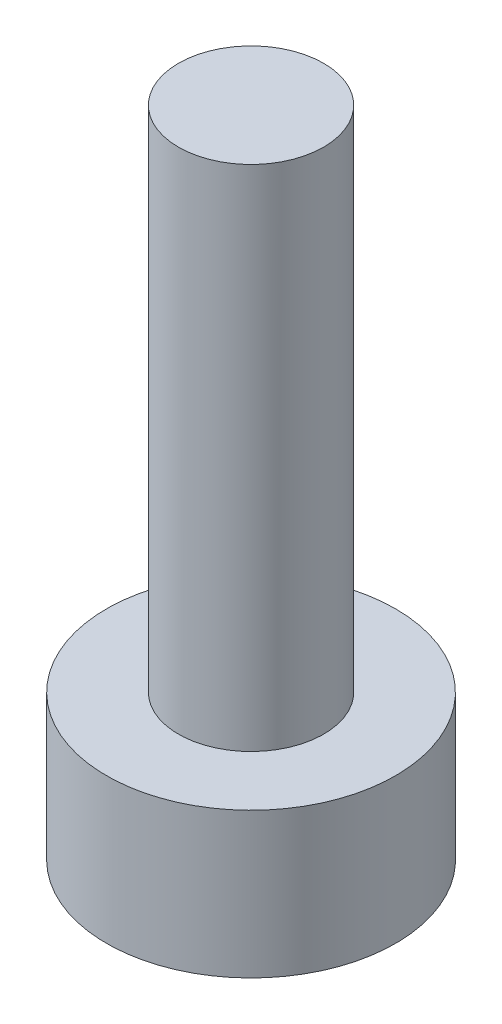
ISO-10303-21;
HEADER;
FILE_DESCRIPTION(('STEP AP214'),'2;1');
FILE_NAME('part.step','',(''),(''),'','','');
FILE_SCHEMA(('AUTOMOTIVE_DESIGN { 1 0 10303 214 1 1 1 1 }'));
ENDSEC;
DATA;
#1=APPLICATION_CONTEXT('core data for automotive mechanical design processes');
#2=APPLICATION_PROTOCOL_DEFINITION('international standard','automotive_design',2000,#1);
#3=PRODUCT_CONTEXT('',#1,'mechanical');
#4=PRODUCT('Part','Part','',(#3));
#5=PRODUCT_RELATED_PRODUCT_CATEGORY('part','',(#4));
#6=PRODUCT_DEFINITION_FORMATION('','',#4);
#7=PRODUCT_DEFINITION_CONTEXT('part definition',#1,'design');
#8=PRODUCT_DEFINITION('design','',#6,#7);
#9=PRODUCT_DEFINITION_SHAPE('','',#8);
#10=(LENGTH_UNIT() NAMED_UNIT(*) SI_UNIT(.MILLI.,.METRE.));
#11=(NAMED_UNIT(*) PLANE_ANGLE_UNIT() SI_UNIT($,.RADIAN.));
#12=(NAMED_UNIT(*) SI_UNIT($,.STERADIAN.) SOLID_ANGLE_UNIT());
#13=UNCERTAINTY_MEASURE_WITH_UNIT(LENGTH_MEASURE(1.E-05),#10,'distance_accuracy_value','');
#14=(GEOMETRIC_REPRESENTATION_CONTEXT(3) GLOBAL_UNCERTAINTY_ASSIGNED_CONTEXT((#13)) GLOBAL_UNIT_ASSIGNED_CONTEXT((#10,
#11,#12)) REPRESENTATION_CONTEXT('',''));
#15=CARTESIAN_POINT('',(0.,0.,0.));
#16=DIRECTION('',(0.,0.,1.));
#17=DIRECTION('',(1.,0.,0.));
#18=AXIS2_PLACEMENT_3D('',#15,#16,#17);
#19=CARTESIAN_POINT('',(0.,7.,0.));
#20=DIRECTION('',(0.,-1.,0.));
#21=DIRECTION('',(0.,0.,-1.));
#22=AXIS2_PLACEMENT_3D('',#19,#20,#21);
#23=CYLINDRICAL_SURFACE('',#22,1.);
#24=CARTESIAN_POINT('',(0.,7.,0.));
#25=DIRECTION('',(0.,1.,0.));
#26=DIRECTION('',(0.,0.,1.));
#27=AXIS2_PLACEMENT_3D('',#24,#25,#26);
#28=CIRCLE('',#27,1.);
#29=CARTESIAN_POINT('',(0.,7.,1.));
#30=VERTEX_POINT('',#29);
#31=EDGE_CURVE('E10',#30,#30,#28,.T.);
#32=ORIENTED_EDGE('',*,*,#31,.F.);
#33=EDGE_LOOP('',(#32));
#34=FACE_BOUND('',#33,.T.);
#35=CARTESIAN_POINT('',(0.,0.,0.));
#36=DIRECTION('',(0.,-1.,0.));
#37=DIRECTION('',(0.,0.,-1.));
#38=AXIS2_PLACEMENT_3D('',#35,#36,#37);
#39=CIRCLE('',#38,1.);
#40=CARTESIAN_POINT('',(0.,0.,-1.));
#41=VERTEX_POINT('',#40);
#42=EDGE_CURVE('E39',#41,#41,#39,.T.);
#43=ORIENTED_EDGE('',*,*,#42,.F.);
#44=EDGE_LOOP('',(#43));
#45=FACE_BOUND('',#44,.T.);
#46=ADVANCED_FACE('F33',(#34,#45),#23,.T.);
#47=CARTESIAN_POINT('',(0.,7.,0.));
#48=DIRECTION('',(0.,1.,0.));
#49=DIRECTION('',(0.,0.,1.));
#50=AXIS2_PLACEMENT_3D('',#47,#48,#49);
#51=PLANE('',#50);
#52=ORIENTED_EDGE('',*,*,#31,.T.);
#53=EDGE_LOOP('',(#52));
#54=FACE_BOUND('',#53,.T.);
#55=ADVANCED_FACE('F66',(#54),#51,.T.);
#56=CARTESIAN_POINT('',(0.,-2.,0.));
#57=DIRECTION('',(0.,1.,0.));
#58=DIRECTION('',(0.,0.,1.));
#59=AXIS2_PLACEMENT_3D('',#56,#57,#58);
#60=CYLINDRICAL_SURFACE('',#59,1.99);
#61=CARTESIAN_POINT('',(0.,-2.,0.));
#62=DIRECTION('',(0.,-1.,0.));
#63=DIRECTION('',(0.,0.,-1.));
#64=AXIS2_PLACEMENT_3D('',#61,#62,#63);
#65=CIRCLE('',#64,1.99);
#66=CARTESIAN_POINT('',(0.,-2.,-1.99));
#67=VERTEX_POINT('',#66);
#68=EDGE_CURVE('E43',#67,#67,#65,.T.);
#69=ORIENTED_EDGE('',*,*,#68,.F.);
#70=EDGE_LOOP('',(#69));
#71=FACE_BOUND('',#70,.T.);
#72=CARTESIAN_POINT('',(0.,0.,0.));
#73=DIRECTION('',(0.,-1.,0.));
#74=DIRECTION('',(0.,0.,-1.));
#75=AXIS2_PLACEMENT_3D('',#72,#73,#74);
#76=CIRCLE('',#75,1.99);
#77=CARTESIAN_POINT('',(0.,0.,-1.99));
#78=VERTEX_POINT('',#77);
#79=EDGE_CURVE('E47',#78,#78,#76,.T.);
#80=ORIENTED_EDGE('',*,*,#79,.T.);
#81=EDGE_LOOP('',(#80));
#82=FACE_BOUND('',#81,.T.);
#83=ADVANCED_FACE('F53',(#71,#82),#60,.T.);
#84=CARTESIAN_POINT('',(0.,-2.,0.));
#85=DIRECTION('',(0.,-1.,0.));
#86=DIRECTION('',(0.,0.,-1.));
#87=AXIS2_PLACEMENT_3D('',#84,#85,#86);
#88=PLANE('',#87);
#89=ORIENTED_EDGE('',*,*,#68,.T.);
#90=EDGE_LOOP('',(#89));
#91=FACE_BOUND('',#90,.T.);
#92=ADVANCED_FACE('F57',(#91),#88,.T.);
#93=CARTESIAN_POINT('',(0.,0.,0.));
#94=DIRECTION('',(0.,-1.,0.));
#95=DIRECTION('',(0.,0.,-1.));
#96=AXIS2_PLACEMENT_3D('',#93,#94,#95);
#97=PLANE('',#96);
#98=ORIENTED_EDGE('',*,*,#42,.T.);
#99=EDGE_LOOP('',(#98));
#100=FACE_BOUND('',#99,.T.);
#101=ORIENTED_EDGE('',*,*,#79,.F.);
#102=EDGE_LOOP('',(#101));
#103=FACE_BOUND('',#102,.T.);
#104=ADVANCED_FACE('F55',(#100,#103),#97,.F.);
#105=CLOSED_SHELL('',(#46,#55,#83,#92,#104));
#106=MANIFOLD_SOLID_BREP('B2',#105);
#107=ADVANCED_BREP_SHAPE_REPRESENTATION('',(#18,#106),#14);
#108=SHAPE_DEFINITION_REPRESENTATION(#9,#107);
ENDSEC;
END-ISO-10303-21;
